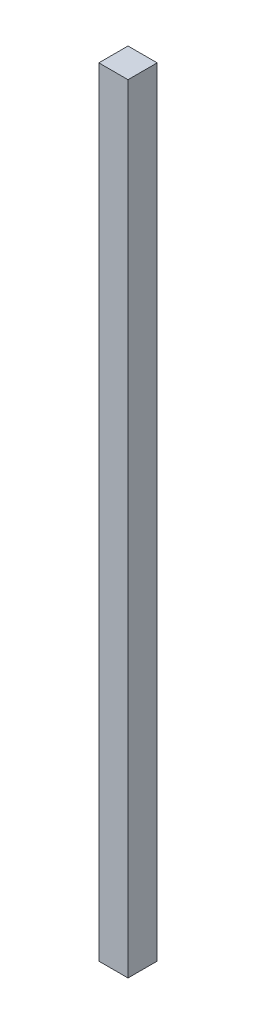
ISO-10303-21;
HEADER;
FILE_DESCRIPTION(('STEP AP214'),'2;1');
FILE_NAME('part.step','',(''),(''),'','','');
FILE_SCHEMA(('AUTOMOTIVE_DESIGN { 1 0 10303 214 1 1 1 1 }'));
ENDSEC;
DATA;
#1=APPLICATION_CONTEXT('core data for automotive mechanical design processes');
#2=APPLICATION_PROTOCOL_DEFINITION('international standard','automotive_design',2000,#1);
#3=PRODUCT_CONTEXT('',#1,'mechanical');
#4=PRODUCT('Part','Part','',(#3));
#5=PRODUCT_RELATED_PRODUCT_CATEGORY('part','',(#4));
#6=PRODUCT_DEFINITION_FORMATION('','',#4);
#7=PRODUCT_DEFINITION_CONTEXT('part definition',#1,'design');
#8=PRODUCT_DEFINITION('design','',#6,#7);
#9=PRODUCT_DEFINITION_SHAPE('','',#8);
#10=(LENGTH_UNIT() NAMED_UNIT(*) SI_UNIT(.MILLI.,.METRE.));
#11=(NAMED_UNIT(*) PLANE_ANGLE_UNIT() SI_UNIT($,.RADIAN.));
#12=(NAMED_UNIT(*) SI_UNIT($,.STERADIAN.) SOLID_ANGLE_UNIT());
#13=UNCERTAINTY_MEASURE_WITH_UNIT(LENGTH_MEASURE(1.E-05),#10,'distance_accuracy_value','');
#14=(GEOMETRIC_REPRESENTATION_CONTEXT(3) GLOBAL_UNCERTAINTY_ASSIGNED_CONTEXT((#13)) GLOBAL_UNIT_ASSIGNED_CONTEXT((#10,
#11,#12)) REPRESENTATION_CONTEXT('',''));
#15=CARTESIAN_POINT('',(0.,0.,0.));
#16=DIRECTION('',(0.,0.,1.));
#17=DIRECTION('',(1.,0.,0.));
#18=AXIS2_PLACEMENT_3D('',#15,#16,#17);
#19=CARTESIAN_POINT('',(0.,400.,0.));
#20=DIRECTION('',(1.,0.,0.));
#21=DIRECTION('',(0.,0.,-1.));
#22=AXIS2_PLACEMENT_3D('',#19,#20,#21);
#23=PLANE('',#22);
#24=DIRECTION('',(0.,0.,1.));
#25=VECTOR('',#24,1.);
#26=CARTESIAN_POINT('',(0.,0.,0.));
#27=LINE('',#26,#25);
#28=CARTESIAN_POINT('',(0.,0.,-15.));
#29=VERTEX_POINT('',#28);
#30=CARTESIAN_POINT('',(0.,0.,0.));
#31=VERTEX_POINT('',#30);
#32=EDGE_CURVE('E102',#29,#31,#27,.T.);
#33=ORIENTED_EDGE('',*,*,#32,.T.);
#34=DIRECTION('',(0.,-1.,0.));
#35=VECTOR('',#34,1.);
#36=CARTESIAN_POINT('',(0.,400.,0.));
#37=LINE('',#36,#35);
#38=CARTESIAN_POINT('',(0.,400.,0.));
#39=VERTEX_POINT('',#38);
#40=EDGE_CURVE('E11',#39,#31,#37,.T.);
#41=ORIENTED_EDGE('',*,*,#40,.F.);
#42=DIRECTION('',(0.,0.,1.));
#43=VECTOR('',#42,1.);
#44=CARTESIAN_POINT('',(0.,400.,0.));
#45=LINE('',#44,#43);
#46=CARTESIAN_POINT('',(0.,400.,-15.));
#47=VERTEX_POINT('',#46);
#48=EDGE_CURVE('E90',#47,#39,#45,.T.);
#49=ORIENTED_EDGE('',*,*,#48,.F.);
#50=DIRECTION('',(0.,-1.,0.));
#51=VECTOR('',#50,1.);
#52=CARTESIAN_POINT('',(0.,400.,-15.));
#53=LINE('',#52,#51);
#54=EDGE_CURVE('E98',#47,#29,#53,.T.);
#55=ORIENTED_EDGE('',*,*,#54,.T.);
#56=EDGE_LOOP('',(#33,#41,#49,#55));
#57=FACE_BOUND('',#56,.T.);
#58=ADVANCED_FACE('F39',(#57),#23,.F.);
#59=CARTESIAN_POINT('',(0.,400.,0.));
#60=DIRECTION('',(0.,0.,-1.));
#61=DIRECTION('',(-1.,0.,0.));
#62=AXIS2_PLACEMENT_3D('',#59,#60,#61);
#63=PLANE('',#62);
#64=DIRECTION('',(1.,0.,0.));
#65=VECTOR('',#64,1.);
#66=CARTESIAN_POINT('',(0.,0.,0.));
#67=LINE('',#66,#65);
#68=CARTESIAN_POINT('',(15.,0.,0.));
#69=VERTEX_POINT('',#68);
#70=EDGE_CURVE('E94',#31,#69,#67,.T.);
#71=ORIENTED_EDGE('',*,*,#70,.T.);
#72=DIRECTION('',(0.,-1.,0.));
#73=VECTOR('',#72,1.);
#74=CARTESIAN_POINT('',(15.,400.,0.));
#75=LINE('',#74,#73);
#76=CARTESIAN_POINT('',(15.,400.,0.));
#77=VERTEX_POINT('',#76);
#78=EDGE_CURVE('E47',#77,#69,#75,.T.);
#79=ORIENTED_EDGE('',*,*,#78,.F.);
#80=DIRECTION('',(1.,0.,0.));
#81=VECTOR('',#80,1.);
#82=CARTESIAN_POINT('',(0.,400.,0.));
#83=LINE('',#82,#81);
#84=EDGE_CURVE('E85',#39,#77,#83,.T.);
#85=ORIENTED_EDGE('',*,*,#84,.F.);
#86=ORIENTED_EDGE('',*,*,#40,.T.);
#87=EDGE_LOOP('',(#71,#79,#85,#86));
#88=FACE_BOUND('',#87,.T.);
#89=ADVANCED_FACE('F93',(#88),#63,.F.);
#90=CARTESIAN_POINT('',(15.,400.,0.));
#91=DIRECTION('',(-1.,0.,0.));
#92=DIRECTION('',(0.,0.,1.));
#93=AXIS2_PLACEMENT_3D('',#90,#91,#92);
#94=PLANE('',#93);
#95=DIRECTION('',(0.,0.,-1.));
#96=VECTOR('',#95,1.);
#97=CARTESIAN_POINT('',(15.,0.,0.));
#98=LINE('',#97,#96);
#99=CARTESIAN_POINT('',(15.,0.,-15.));
#100=VERTEX_POINT('',#99);
#101=EDGE_CURVE('E72',#69,#100,#98,.T.);
#102=ORIENTED_EDGE('',*,*,#101,.T.);
#103=DIRECTION('',(0.,-1.,0.));
#104=VECTOR('',#103,1.);
#105=CARTESIAN_POINT('',(15.,400.,-15.));
#106=LINE('',#105,#104);
#107=CARTESIAN_POINT('',(15.,400.,-15.));
#108=VERTEX_POINT('',#107);
#109=EDGE_CURVE('E95',#108,#100,#106,.T.);
#110=ORIENTED_EDGE('',*,*,#109,.F.);
#111=DIRECTION('',(0.,0.,-1.));
#112=VECTOR('',#111,1.);
#113=CARTESIAN_POINT('',(15.,400.,0.));
#114=LINE('',#113,#112);
#115=EDGE_CURVE('E88',#77,#108,#114,.T.);
#116=ORIENTED_EDGE('',*,*,#115,.F.);
#117=ORIENTED_EDGE('',*,*,#78,.T.);
#118=EDGE_LOOP('',(#102,#110,#116,#117));
#119=FACE_BOUND('',#118,.T.);
#120=ADVANCED_FACE('F96',(#119),#94,.F.);
#121=CARTESIAN_POINT('',(0.,400.,-15.));
#122=DIRECTION('',(0.,0.,1.));
#123=DIRECTION('',(1.,0.,0.));
#124=AXIS2_PLACEMENT_3D('',#121,#122,#123);
#125=PLANE('',#124);
#126=DIRECTION('',(-1.,0.,0.));
#127=VECTOR('',#126,1.);
#128=CARTESIAN_POINT('',(0.,0.,-15.));
#129=LINE('',#128,#127);
#130=EDGE_CURVE('E78',#100,#29,#129,.T.);
#131=ORIENTED_EDGE('',*,*,#130,.T.);
#132=ORIENTED_EDGE('',*,*,#54,.F.);
#133=DIRECTION('',(-1.,0.,0.));
#134=VECTOR('',#133,1.);
#135=CARTESIAN_POINT('',(0.,400.,-15.));
#136=LINE('',#135,#134);
#137=EDGE_CURVE('E55',#108,#47,#136,.T.);
#138=ORIENTED_EDGE('',*,*,#137,.F.);
#139=ORIENTED_EDGE('',*,*,#109,.T.);
#140=EDGE_LOOP('',(#131,#132,#138,#139));
#141=FACE_BOUND('',#140,.T.);
#142=ADVANCED_FACE('F109',(#141),#125,.F.);
#143=CARTESIAN_POINT('',(0.,400.,0.));
#144=DIRECTION('',(0.,-1.,0.));
#145=DIRECTION('',(0.,0.,-1.));
#146=AXIS2_PLACEMENT_3D('',#143,#144,#145);
#147=PLANE('',#146);
#148=ORIENTED_EDGE('',*,*,#48,.T.);
#149=ORIENTED_EDGE('',*,*,#84,.T.);
#150=ORIENTED_EDGE('',*,*,#115,.T.);
#151=ORIENTED_EDGE('',*,*,#137,.T.);
#152=EDGE_LOOP('',(#148,#149,#150,#151));
#153=FACE_BOUND('',#152,.T.);
#154=ADVANCED_FACE('F86',(#153),#147,.F.);
#155=CARTESIAN_POINT('',(0.,0.,0.));
#156=DIRECTION('',(0.,-1.,0.));
#157=DIRECTION('',(0.,0.,-1.));
#158=AXIS2_PLACEMENT_3D('',#155,#156,#157);
#159=PLANE('',#158);
#160=ORIENTED_EDGE('',*,*,#32,.F.);
#161=ORIENTED_EDGE('',*,*,#130,.F.);
#162=ORIENTED_EDGE('',*,*,#101,.F.);
#163=ORIENTED_EDGE('',*,*,#70,.F.);
#164=EDGE_LOOP('',(#160,#161,#162,#163));
#165=FACE_BOUND('',#164,.T.);
#166=ADVANCED_FACE('F112',(#165),#159,.T.);
#167=CLOSED_SHELL('',(#58,#89,#120,#142,#154,#166));
#168=MANIFOLD_SOLID_BREP('B2',#167);
#169=ADVANCED_BREP_SHAPE_REPRESENTATION('',(#18,#168),#14);
#170=SHAPE_DEFINITION_REPRESENTATION(#9,#169);
ENDSEC;
END-ISO-10303-21;
